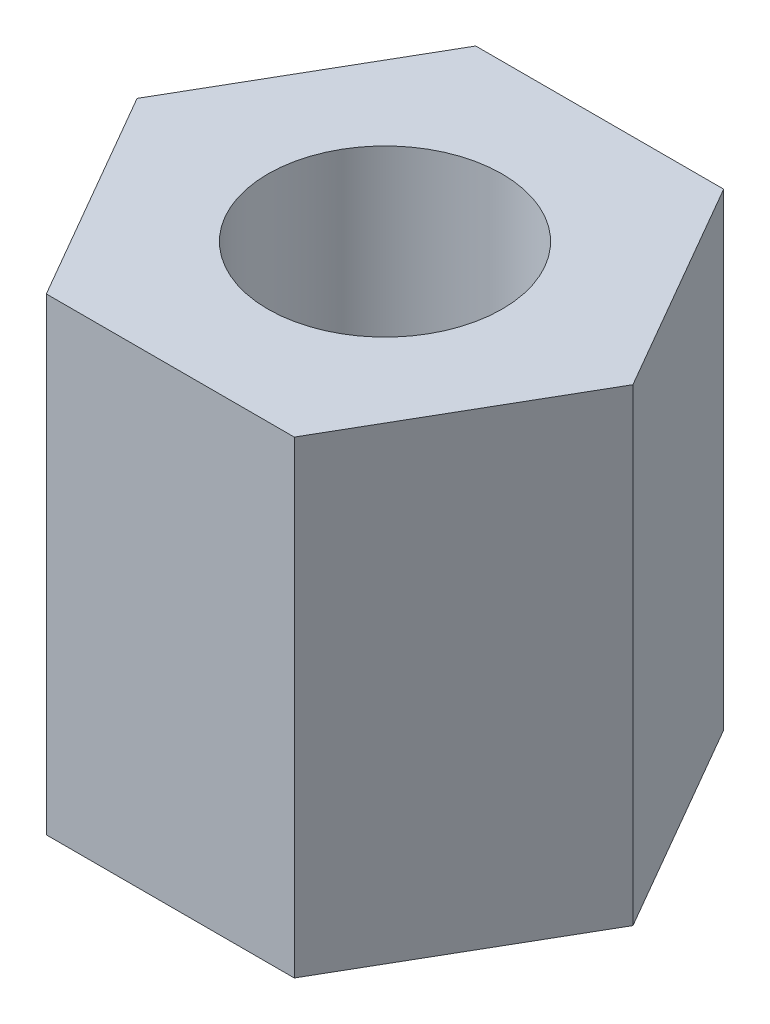
ISO-10303-21;
HEADER;
FILE_DESCRIPTION(('STEP AP214'),'2;1');
FILE_NAME('part.step','',(''),(''),'','','');
FILE_SCHEMA(('AUTOMOTIVE_DESIGN { 1 0 10303 214 1 1 1 1 }'));
ENDSEC;
DATA;
#1=APPLICATION_CONTEXT('core data for automotive mechanical design processes');
#2=APPLICATION_PROTOCOL_DEFINITION('international standard','automotive_design',2000,#1);
#3=PRODUCT_CONTEXT('',#1,'mechanical');
#4=PRODUCT('Part','Part','',(#3));
#5=PRODUCT_RELATED_PRODUCT_CATEGORY('part','',(#4));
#6=PRODUCT_DEFINITION_FORMATION('','',#4);
#7=PRODUCT_DEFINITION_CONTEXT('part definition',#1,'design');
#8=PRODUCT_DEFINITION('design','',#6,#7);
#9=PRODUCT_DEFINITION_SHAPE('','',#8);
#10=(LENGTH_UNIT() NAMED_UNIT(*) SI_UNIT(.MILLI.,.METRE.));
#11=(NAMED_UNIT(*) PLANE_ANGLE_UNIT() SI_UNIT($,.RADIAN.));
#12=(NAMED_UNIT(*) SI_UNIT($,.STERADIAN.) SOLID_ANGLE_UNIT());
#13=UNCERTAINTY_MEASURE_WITH_UNIT(LENGTH_MEASURE(1.E-05),#10,'distance_accuracy_value','');
#14=(GEOMETRIC_REPRESENTATION_CONTEXT(3) GLOBAL_UNCERTAINTY_ASSIGNED_CONTEXT((#13)) GLOBAL_UNIT_ASSIGNED_CONTEXT((#10,
#11,#12)) REPRESENTATION_CONTEXT('',''));
#15=CARTESIAN_POINT('',(0.,0.,0.));
#16=DIRECTION('',(0.,0.,1.));
#17=DIRECTION('',(1.,0.,0.));
#18=AXIS2_PLACEMENT_3D('',#15,#16,#17);
#19=CARTESIAN_POINT('',(0.,6.,0.));
#20=DIRECTION('',(0.,1.,0.));
#21=DIRECTION('',(0.,0.,1.));
#22=AXIS2_PLACEMENT_3D('',#19,#20,#21);
#23=PLANE('',#22);
#24=DIRECTION('',(0.5,0.,-0.866025403784439));
#25=VECTOR('',#24,1.);
#26=CARTESIAN_POINT('',(-5.73489304903012,6.,-4.82224059461863));
#27=LINE('',#26,#25);
#28=CARTESIAN_POINT('',(-5.73489304903012,6.,-4.82224059461863));
#29=VERTEX_POINT('',#28);
#30=CARTESIAN_POINT('',(-4.14717980875865,6.,-7.57224059461863));
#31=VERTEX_POINT('',#30);
#32=EDGE_CURVE('E146',#29,#31,#27,.T.);
#33=ORIENTED_EDGE('',*,*,#32,.T.);
#34=DIRECTION('',(-0.5,0.,-0.866025403784439));
#35=VECTOR('',#34,1.);
#36=CARTESIAN_POINT('',(-4.14717980875865,6.,-7.57224059461863));
#37=LINE('',#36,#35);
#38=CARTESIAN_POINT('',(-5.73489304903012,6.,-10.3222405946186));
#39=VERTEX_POINT('',#38);
#40=EDGE_CURVE('E94',#31,#39,#37,.T.);
#41=ORIENTED_EDGE('',*,*,#40,.T.);
#42=DIRECTION('',(-1.,0.,0.));
#43=VECTOR('',#42,1.);
#44=CARTESIAN_POINT('',(-5.73489304903012,6.,-10.3222405946186));
#45=LINE('',#44,#43);
#46=CARTESIAN_POINT('',(-8.91031952957306,6.,-10.3222405946186));
#47=VERTEX_POINT('',#46);
#48=EDGE_CURVE('E107',#39,#47,#45,.T.);
#49=ORIENTED_EDGE('',*,*,#48,.T.);
#50=DIRECTION('',(-0.5,0.,0.866025403784439));
#51=VECTOR('',#50,1.);
#52=CARTESIAN_POINT('',(-8.91031952957306,6.,-10.3222405946186));
#53=LINE('',#52,#51);
#54=CARTESIAN_POINT('',(-10.4980327698445,6.,-7.57224059461863));
#55=VERTEX_POINT('',#54);
#56=EDGE_CURVE('E101',#47,#55,#53,.T.);
#57=ORIENTED_EDGE('',*,*,#56,.T.);
#58=DIRECTION('',(0.5,0.,0.866025403784439));
#59=VECTOR('',#58,1.);
#60=CARTESIAN_POINT('',(-10.4980327698445,6.,-7.57224059461863));
#61=LINE('',#60,#59);
#62=CARTESIAN_POINT('',(-8.91031952957306,6.,-4.82224059461863));
#63=VERTEX_POINT('',#62);
#64=EDGE_CURVE('E105',#55,#63,#61,.T.);
#65=ORIENTED_EDGE('',*,*,#64,.T.);
#66=DIRECTION('',(1.,0.,0.));
#67=VECTOR('',#66,1.);
#68=CARTESIAN_POINT('',(-8.91031952957306,6.,-4.82224059461863));
#69=LINE('',#68,#67);
#70=EDGE_CURVE('E57',#63,#29,#69,.T.);
#71=ORIENTED_EDGE('',*,*,#70,.T.);
#72=EDGE_LOOP('',(#33,#41,#49,#57,#65,#71));
#73=FACE_BOUND('',#72,.T.);
#74=CARTESIAN_POINT('',(-7.32260628930159,6.,-7.57224059461863));
#75=DIRECTION('',(0.,1.,0.));
#76=DIRECTION('',(0.,0.,1.));
#77=AXIS2_PLACEMENT_3D('',#74,#75,#76);
#78=CIRCLE('',#77,1.5);
#79=CARTESIAN_POINT('',(-7.32260628930159,6.,-6.07224059461863));
#80=VERTEX_POINT('',#79);
#81=EDGE_CURVE('E134',#80,#80,#78,.T.);
#82=ORIENTED_EDGE('',*,*,#81,.F.);
#83=EDGE_LOOP('',(#82));
#84=FACE_BOUND('',#83,.T.);
#85=ADVANCED_FACE('F39',(#73,#84),#23,.T.);
#86=CARTESIAN_POINT('',(0.,0.,0.));
#87=DIRECTION('',(0.,1.,0.));
#88=DIRECTION('',(0.,0.,1.));
#89=AXIS2_PLACEMENT_3D('',#86,#87,#88);
#90=PLANE('',#89);
#91=DIRECTION('',(0.5,0.,-0.866025403784439));
#92=VECTOR('',#91,1.);
#93=CARTESIAN_POINT('',(-5.73489304903012,0.,-4.82224059461863));
#94=LINE('',#93,#92);
#95=CARTESIAN_POINT('',(-5.73489304903012,0.,-4.82224059461863));
#96=VERTEX_POINT('',#95);
#97=CARTESIAN_POINT('',(-4.14717980875865,0.,-7.57224059461863));
#98=VERTEX_POINT('',#97);
#99=EDGE_CURVE('E129',#96,#98,#94,.T.);
#100=ORIENTED_EDGE('',*,*,#99,.F.);
#101=DIRECTION('',(1.,0.,0.));
#102=VECTOR('',#101,1.);
#103=CARTESIAN_POINT('',(-8.91031952957306,0.,-4.82224059461863));
#104=LINE('',#103,#102);
#105=CARTESIAN_POINT('',(-8.91031952957306,0.,-4.82224059461863));
#106=VERTEX_POINT('',#105);
#107=EDGE_CURVE('E86',#106,#96,#104,.T.);
#108=ORIENTED_EDGE('',*,*,#107,.F.);
#109=DIRECTION('',(0.5,0.,0.866025403784439));
#110=VECTOR('',#109,1.);
#111=CARTESIAN_POINT('',(-10.4980327698445,0.,-7.57224059461863));
#112=LINE('',#111,#110);
#113=CARTESIAN_POINT('',(-10.4980327698445,0.,-7.57224059461863));
#114=VERTEX_POINT('',#113);
#115=EDGE_CURVE('E80',#114,#106,#112,.T.);
#116=ORIENTED_EDGE('',*,*,#115,.F.);
#117=DIRECTION('',(-0.5,0.,0.866025403784439));
#118=VECTOR('',#117,1.);
#119=CARTESIAN_POINT('',(-8.91031952957306,0.,-10.3222405946186));
#120=LINE('',#119,#118);
#121=CARTESIAN_POINT('',(-8.91031952957306,0.,-10.3222405946186));
#122=VERTEX_POINT('',#121);
#123=EDGE_CURVE('E116',#122,#114,#120,.T.);
#124=ORIENTED_EDGE('',*,*,#123,.F.);
#125=DIRECTION('',(-1.,0.,0.));
#126=VECTOR('',#125,1.);
#127=CARTESIAN_POINT('',(-5.73489304903012,0.,-10.3222405946186));
#128=LINE('',#127,#126);
#129=CARTESIAN_POINT('',(-5.73489304903012,0.,-10.3222405946186));
#130=VERTEX_POINT('',#129);
#131=EDGE_CURVE('E137',#130,#122,#128,.T.);
#132=ORIENTED_EDGE('',*,*,#131,.F.);
#133=DIRECTION('',(-0.5,0.,-0.866025403784439));
#134=VECTOR('',#133,1.);
#135=CARTESIAN_POINT('',(-4.14717980875865,0.,-7.57224059461863));
#136=LINE('',#135,#134);
#137=EDGE_CURVE('E133',#98,#130,#136,.T.);
#138=ORIENTED_EDGE('',*,*,#137,.F.);
#139=EDGE_LOOP('',(#100,#108,#116,#124,#132,#138));
#140=FACE_BOUND('',#139,.T.);
#141=CARTESIAN_POINT('',(-7.32260628930159,0.,-7.57224059461863));
#142=DIRECTION('',(0.,1.,0.));
#143=DIRECTION('',(0.,0.,1.));
#144=AXIS2_PLACEMENT_3D('',#141,#142,#143);
#145=CIRCLE('',#144,1.5);
#146=CARTESIAN_POINT('',(-7.32260628930159,0.,-6.07224059461863));
#147=VERTEX_POINT('',#146);
#148=EDGE_CURVE('E243',#147,#147,#145,.T.);
#149=ORIENTED_EDGE('',*,*,#148,.T.);
#150=EDGE_LOOP('',(#149));
#151=FACE_BOUND('',#150,.T.);
#152=ADVANCED_FACE('F159',(#140,#151),#90,.F.);
#153=CARTESIAN_POINT('',(-5.73489304903012,6.,-4.82224059461863));
#154=DIRECTION('',(-0.866025403784439,0.,-0.5));
#155=DIRECTION('',(-0.5,0.,0.866025403784439));
#156=AXIS2_PLACEMENT_3D('',#153,#154,#155);
#157=PLANE('',#156);
#158=ORIENTED_EDGE('',*,*,#99,.T.);
#159=DIRECTION('',(0.,-1.,0.));
#160=VECTOR('',#159,1.);
#161=CARTESIAN_POINT('',(-4.14717980875865,6.,-7.57224059461863));
#162=LINE('',#161,#160);
#163=EDGE_CURVE('E11',#31,#98,#162,.T.);
#164=ORIENTED_EDGE('',*,*,#163,.F.);
#165=ORIENTED_EDGE('',*,*,#32,.F.);
#166=DIRECTION('',(0.,-1.,0.));
#167=VECTOR('',#166,1.);
#168=CARTESIAN_POINT('',(-5.73489304903012,6.,-4.82224059461863));
#169=LINE('',#168,#167);
#170=EDGE_CURVE('E125',#29,#96,#169,.T.);
#171=ORIENTED_EDGE('',*,*,#170,.T.);
#172=EDGE_LOOP('',(#158,#164,#165,#171));
#173=FACE_BOUND('',#172,.T.);
#174=ADVANCED_FACE('F41',(#173),#157,.F.);
#175=CARTESIAN_POINT('',(-4.14717980875865,6.,-7.57224059461863));
#176=DIRECTION('',(-0.866025403784439,0.,0.5));
#177=DIRECTION('',(0.5,0.,0.866025403784439));
#178=AXIS2_PLACEMENT_3D('',#175,#176,#177);
#179=PLANE('',#178);
#180=ORIENTED_EDGE('',*,*,#137,.T.);
#181=DIRECTION('',(0.,-1.,0.));
#182=VECTOR('',#181,1.);
#183=CARTESIAN_POINT('',(-5.73489304903012,6.,-10.3222405946186));
#184=LINE('',#183,#182);
#185=EDGE_CURVE('E49',#39,#130,#184,.T.);
#186=ORIENTED_EDGE('',*,*,#185,.F.);
#187=ORIENTED_EDGE('',*,*,#40,.F.);
#188=ORIENTED_EDGE('',*,*,#163,.T.);
#189=EDGE_LOOP('',(#180,#186,#187,#188));
#190=FACE_BOUND('',#189,.T.);
#191=ADVANCED_FACE('F184',(#190),#179,.F.);
#192=CARTESIAN_POINT('',(-5.73489304903012,6.,-10.3222405946186));
#193=DIRECTION('',(0.,0.,1.));
#194=DIRECTION('',(1.,0.,0.));
#195=AXIS2_PLACEMENT_3D('',#192,#193,#194);
#196=PLANE('',#195);
#197=ORIENTED_EDGE('',*,*,#131,.T.);
#198=DIRECTION('',(0.,-1.,0.));
#199=VECTOR('',#198,1.);
#200=CARTESIAN_POINT('',(-8.91031952957306,6.,-10.3222405946186));
#201=LINE('',#200,#199);
#202=EDGE_CURVE('E118',#47,#122,#201,.T.);
#203=ORIENTED_EDGE('',*,*,#202,.F.);
#204=ORIENTED_EDGE('',*,*,#48,.F.);
#205=ORIENTED_EDGE('',*,*,#185,.T.);
#206=EDGE_LOOP('',(#197,#203,#204,#205));
#207=FACE_BOUND('',#206,.T.);
#208=ADVANCED_FACE('F156',(#207),#196,.F.);
#209=CARTESIAN_POINT('',(-8.91031952957306,6.,-10.3222405946186));
#210=DIRECTION('',(0.866025403784439,0.,0.5));
#211=DIRECTION('',(0.5,0.,-0.866025403784439));
#212=AXIS2_PLACEMENT_3D('',#209,#210,#211);
#213=PLANE('',#212);
#214=ORIENTED_EDGE('',*,*,#123,.T.);
#215=DIRECTION('',(0.,-1.,0.));
#216=VECTOR('',#215,1.);
#217=CARTESIAN_POINT('',(-10.4980327698445,6.,-7.57224059461863));
#218=LINE('',#217,#216);
#219=EDGE_CURVE('E113',#55,#114,#218,.T.);
#220=ORIENTED_EDGE('',*,*,#219,.F.);
#221=ORIENTED_EDGE('',*,*,#56,.F.);
#222=ORIENTED_EDGE('',*,*,#202,.T.);
#223=EDGE_LOOP('',(#214,#220,#221,#222));
#224=FACE_BOUND('',#223,.T.);
#225=ADVANCED_FACE('F114',(#224),#213,.F.);
#226=CARTESIAN_POINT('',(-10.4980327698445,6.,-7.57224059461863));
#227=DIRECTION('',(0.866025403784439,0.,-0.5));
#228=DIRECTION('',(-0.5,0.,-0.866025403784439));
#229=AXIS2_PLACEMENT_3D('',#226,#227,#228);
#230=PLANE('',#229);
#231=ORIENTED_EDGE('',*,*,#115,.T.);
#232=DIRECTION('',(0.,-1.,0.));
#233=VECTOR('',#232,1.);
#234=CARTESIAN_POINT('',(-8.91031952957306,6.,-4.82224059461863));
#235=LINE('',#234,#233);
#236=EDGE_CURVE('E119',#63,#106,#235,.T.);
#237=ORIENTED_EDGE('',*,*,#236,.F.);
#238=ORIENTED_EDGE('',*,*,#64,.F.);
#239=ORIENTED_EDGE('',*,*,#219,.T.);
#240=EDGE_LOOP('',(#231,#237,#238,#239));
#241=FACE_BOUND('',#240,.T.);
#242=ADVANCED_FACE('F121',(#241),#230,.F.);
#243=CARTESIAN_POINT('',(-8.91031952957306,6.,-4.82224059461863));
#244=DIRECTION('',(0.,0.,-1.));
#245=DIRECTION('',(-1.,0.,0.));
#246=AXIS2_PLACEMENT_3D('',#243,#244,#245);
#247=PLANE('',#246);
#248=ORIENTED_EDGE('',*,*,#107,.T.);
#249=ORIENTED_EDGE('',*,*,#170,.F.);
#250=ORIENTED_EDGE('',*,*,#70,.F.);
#251=ORIENTED_EDGE('',*,*,#236,.T.);
#252=EDGE_LOOP('',(#248,#249,#250,#251));
#253=FACE_BOUND('',#252,.T.);
#254=ADVANCED_FACE('F164',(#253),#247,.F.);
#255=CARTESIAN_POINT('',(-7.32260628930159,6.,-7.57224059461863));
#256=DIRECTION('',(0.,-1.,0.));
#257=DIRECTION('',(0.,0.,-1.));
#258=AXIS2_PLACEMENT_3D('',#255,#256,#257);
#259=CYLINDRICAL_SURFACE('',#258,1.5);
#260=ORIENTED_EDGE('',*,*,#81,.T.);
#261=EDGE_LOOP('',(#260));
#262=FACE_BOUND('',#261,.T.);
#263=ORIENTED_EDGE('',*,*,#148,.F.);
#264=EDGE_LOOP('',(#263));
#265=FACE_BOUND('',#264,.T.);
#266=ADVANCED_FACE('F166',(#262,#265),#259,.F.);
#267=CLOSED_SHELL('',(#85,#152,#174,#191,#208,#225,#242,#254,#266));
#268=MANIFOLD_SOLID_BREP('B2',#267);
#269=ADVANCED_BREP_SHAPE_REPRESENTATION('',(#18,#268),#14);
#270=SHAPE_DEFINITION_REPRESENTATION(#9,#269);
ENDSEC;
END-ISO-10303-21;
